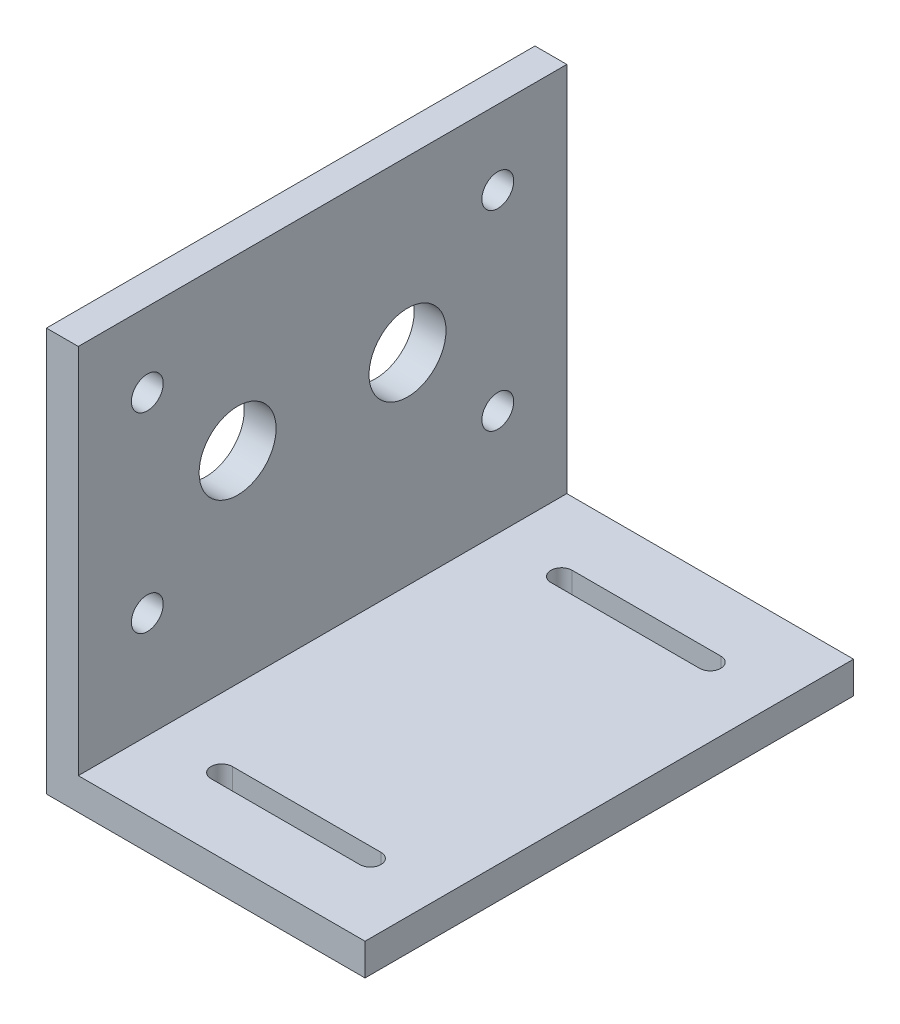
ISO-10303-21;
HEADER;
FILE_DESCRIPTION(('STEP AP214'),'2;1');
FILE_NAME('part.step','',(''),(''),'','','');
FILE_SCHEMA(('AUTOMOTIVE_DESIGN { 1 0 10303 214 1 1 1 1 }'));
ENDSEC;
DATA;
#1=APPLICATION_CONTEXT('core data for automotive mechanical design processes');
#2=APPLICATION_PROTOCOL_DEFINITION('international standard','automotive_design',2000,#1);
#3=PRODUCT_CONTEXT('',#1,'mechanical');
#4=PRODUCT('Part','Part','',(#3));
#5=PRODUCT_RELATED_PRODUCT_CATEGORY('part','',(#4));
#6=PRODUCT_DEFINITION_FORMATION('','',#4);
#7=PRODUCT_DEFINITION_CONTEXT('part definition',#1,'design');
#8=PRODUCT_DEFINITION('design','',#6,#7);
#9=PRODUCT_DEFINITION_SHAPE('','',#8);
#10=(LENGTH_UNIT() NAMED_UNIT(*) SI_UNIT(.MILLI.,.METRE.));
#11=(NAMED_UNIT(*) PLANE_ANGLE_UNIT() SI_UNIT($,.RADIAN.));
#12=(NAMED_UNIT(*) SI_UNIT($,.STERADIAN.) SOLID_ANGLE_UNIT());
#13=UNCERTAINTY_MEASURE_WITH_UNIT(LENGTH_MEASURE(1.E-05),#10,'distance_accuracy_value','');
#14=(GEOMETRIC_REPRESENTATION_CONTEXT(3) GLOBAL_UNCERTAINTY_ASSIGNED_CONTEXT((#13)) GLOBAL_UNIT_ASSIGNED_CONTEXT((#10,
#11,#12)) REPRESENTATION_CONTEXT('',''));
#15=CARTESIAN_POINT('',(0.,0.,0.));
#16=DIRECTION('',(0.,0.,1.));
#17=DIRECTION('',(1.,0.,0.));
#18=AXIS2_PLACEMENT_3D('',#15,#16,#17);
#19=CARTESIAN_POINT('',(0.,0.,46.));
#20=DIRECTION('',(1.,0.,0.));
#21=DIRECTION('',(0.,0.,-1.));
#22=AXIS2_PLACEMENT_3D('',#19,#20,#21);
#23=PLANE('',#22);
#24=CARTESIAN_POINT('',(0.,31.,6.5));
#25=DIRECTION('',(-1.,0.,0.));
#26=DIRECTION('',(0.,0.,-1.));
#27=AXIS2_PLACEMENT_3D('',#24,#25,#26);
#28=CIRCLE('',#27,1.5);
#29=CARTESIAN_POINT('',(0.,31.,4.99999999999999));
#30=VERTEX_POINT('',#29);
#31=EDGE_CURVE('E215',#30,#30,#28,.T.);
#32=ORIENTED_EDGE('',*,*,#31,.F.);
#33=EDGE_LOOP('',(#32));
#34=FACE_BOUND('',#33,.T.);
#35=CARTESIAN_POINT('',(0.,13.,39.5));
#36=DIRECTION('',(-1.,0.,0.));
#37=DIRECTION('',(0.,0.,-1.));
#38=AXIS2_PLACEMENT_3D('',#35,#36,#37);
#39=CIRCLE('',#38,1.5);
#40=CARTESIAN_POINT('',(0.,13.,38.));
#41=VERTEX_POINT('',#40);
#42=EDGE_CURVE('E214',#41,#41,#39,.T.);
#43=ORIENTED_EDGE('',*,*,#42,.F.);
#44=EDGE_LOOP('',(#43));
#45=FACE_BOUND('',#44,.T.);
#46=CARTESIAN_POINT('',(0.,13.,6.5));
#47=DIRECTION('',(-1.,0.,0.));
#48=DIRECTION('',(0.,0.,1.));
#49=AXIS2_PLACEMENT_3D('',#46,#47,#48);
#50=CIRCLE('',#49,1.5);
#51=CARTESIAN_POINT('',(0.,13.,8.));
#52=VERTEX_POINT('',#51);
#53=EDGE_CURVE('E211',#52,#52,#50,.T.);
#54=ORIENTED_EDGE('',*,*,#53,.F.);
#55=EDGE_LOOP('',(#54));
#56=FACE_BOUND('',#55,.T.);
#57=CARTESIAN_POINT('',(0.,31.,39.5));
#58=DIRECTION('',(-1.,0.,0.));
#59=DIRECTION('',(0.,0.,1.));
#60=AXIS2_PLACEMENT_3D('',#57,#58,#59);
#61=CIRCLE('',#60,1.5);
#62=CARTESIAN_POINT('',(0.,31.,41.));
#63=VERTEX_POINT('',#62);
#64=EDGE_CURVE('E218',#63,#63,#61,.T.);
#65=ORIENTED_EDGE('',*,*,#64,.F.);
#66=EDGE_LOOP('',(#65));
#67=FACE_BOUND('',#66,.T.);
#68=CARTESIAN_POINT('',(0.,22.,15.));
#69=DIRECTION('',(1.,0.,0.));
#70=DIRECTION('',(0.,0.,-1.));
#71=AXIS2_PLACEMENT_3D('',#68,#69,#70);
#72=CIRCLE('',#71,3.625);
#73=CARTESIAN_POINT('',(0.,22.,11.375));
#74=VERTEX_POINT('',#73);
#75=EDGE_CURVE('E233',#74,#74,#72,.T.);
#76=ORIENTED_EDGE('',*,*,#75,.T.);
#77=EDGE_LOOP('',(#76));
#78=FACE_BOUND('',#77,.T.);
#79=CARTESIAN_POINT('',(0.,22.,31.));
#80=DIRECTION('',(1.,0.,0.));
#81=DIRECTION('',(0.,0.,-1.));
#82=AXIS2_PLACEMENT_3D('',#79,#80,#81);
#83=CIRCLE('',#82,3.625);
#84=CARTESIAN_POINT('',(0.,22.,27.375));
#85=VERTEX_POINT('',#84);
#86=EDGE_CURVE('E227',#85,#85,#83,.T.);
#87=ORIENTED_EDGE('',*,*,#86,.T.);
#88=EDGE_LOOP('',(#87));
#89=FACE_BOUND('',#88,.T.);
#90=DIRECTION('',(0.,-1.,0.));
#91=VECTOR('',#90,1.);
#92=CARTESIAN_POINT('',(0.,0.,0.));
#93=LINE('',#92,#91);
#94=CARTESIAN_POINT('',(0.,38.,0.));
#95=VERTEX_POINT('',#94);
#96=CARTESIAN_POINT('',(0.,0.,0.));
#97=VERTEX_POINT('',#96);
#98=EDGE_CURVE('E236',#95,#97,#93,.T.);
#99=ORIENTED_EDGE('',*,*,#98,.T.);
#100=DIRECTION('',(0.,0.,-1.));
#101=VECTOR('',#100,1.);
#102=CARTESIAN_POINT('',(0.,0.,46.));
#103=LINE('',#102,#101);
#104=CARTESIAN_POINT('',(0.,0.,46.));
#105=VERTEX_POINT('',#104);
#106=EDGE_CURVE('E11',#105,#97,#103,.T.);
#107=ORIENTED_EDGE('',*,*,#106,.F.);
#108=DIRECTION('',(0.,-1.,0.));
#109=VECTOR('',#108,1.);
#110=CARTESIAN_POINT('',(0.,0.,46.));
#111=LINE('',#110,#109);
#112=CARTESIAN_POINT('',(0.,38.,46.));
#113=VERTEX_POINT('',#112);
#114=EDGE_CURVE('E237',#113,#105,#111,.T.);
#115=ORIENTED_EDGE('',*,*,#114,.F.);
#116=DIRECTION('',(0.,0.,-1.));
#117=VECTOR('',#116,1.);
#118=CARTESIAN_POINT('',(0.,38.,46.));
#119=LINE('',#118,#117);
#120=EDGE_CURVE('E251',#113,#95,#119,.T.);
#121=ORIENTED_EDGE('',*,*,#120,.T.);
#122=EDGE_LOOP('',(#99,#107,#115,#121));
#123=FACE_BOUND('',#122,.T.);
#124=ADVANCED_FACE('F39',(#34,#45,#56,#67,#78,#89,#123),#23,.F.);
#125=CARTESIAN_POINT('',(0.,0.,46.));
#126=DIRECTION('',(0.,1.,0.));
#127=DIRECTION('',(0.,0.,1.));
#128=AXIS2_PLACEMENT_3D('',#125,#126,#127);
#129=PLANE('',#128);
#130=DIRECTION('',(1.,0.,0.));
#131=VECTOR('',#130,1.);
#132=CARTESIAN_POINT('',(0.,0.,8.));
#133=LINE('',#132,#131);
#134=CARTESIAN_POINT('',(9.49999999999999,0.,8.));
#135=VERTEX_POINT('',#134);
#136=CARTESIAN_POINT('',(23.5,0.,8.));
#137=VERTEX_POINT('',#136);
#138=EDGE_CURVE('E205',#135,#137,#133,.T.);
#139=ORIENTED_EDGE('',*,*,#138,.T.);
#140=CARTESIAN_POINT('',(23.5,0.,7.));
#141=DIRECTION('',(0.,1.,0.));
#142=DIRECTION('',(0.,0.,1.));
#143=AXIS2_PLACEMENT_3D('',#140,#141,#142);
#144=CIRCLE('',#143,1.);
#145=CARTESIAN_POINT('',(23.5,0.,6.));
#146=VERTEX_POINT('',#145);
#147=EDGE_CURVE('E208',#137,#146,#144,.T.);
#148=ORIENTED_EDGE('',*,*,#147,.T.);
#149=DIRECTION('',(-1.,0.,0.));
#150=VECTOR('',#149,1.);
#151=CARTESIAN_POINT('',(0.,0.,6.));
#152=LINE('',#151,#150);
#153=CARTESIAN_POINT('',(9.49999999999999,0.,6.));
#154=VERTEX_POINT('',#153);
#155=EDGE_CURVE('E202',#146,#154,#152,.T.);
#156=ORIENTED_EDGE('',*,*,#155,.T.);
#157=CARTESIAN_POINT('',(9.49999999999998,0.,7.));
#158=DIRECTION('',(0.,1.,0.));
#159=DIRECTION('',(0.,0.,1.));
#160=AXIS2_PLACEMENT_3D('',#157,#158,#159);
#161=CIRCLE('',#160,1.);
#162=EDGE_CURVE('E146',#154,#135,#161,.T.);
#163=ORIENTED_EDGE('',*,*,#162,.T.);
#164=EDGE_LOOP('',(#139,#148,#156,#163));
#165=FACE_BOUND('',#164,.T.);
#166=DIRECTION('',(1.,0.,0.));
#167=VECTOR('',#166,1.);
#168=CARTESIAN_POINT('',(0.,0.,40.));
#169=LINE('',#168,#167);
#170=CARTESIAN_POINT('',(9.49999999999999,0.,40.));
#171=VERTEX_POINT('',#170);
#172=CARTESIAN_POINT('',(23.5,0.,40.));
#173=VERTEX_POINT('',#172);
#174=EDGE_CURVE('E196',#171,#173,#169,.T.);
#175=ORIENTED_EDGE('',*,*,#174,.T.);
#176=CARTESIAN_POINT('',(23.5,0.,39.));
#177=DIRECTION('',(0.,1.,0.));
#178=DIRECTION('',(0.,0.,1.));
#179=AXIS2_PLACEMENT_3D('',#176,#177,#178);
#180=CIRCLE('',#179,1.);
#181=CARTESIAN_POINT('',(23.5,0.,38.));
#182=VERTEX_POINT('',#181);
#183=EDGE_CURVE('E199',#173,#182,#180,.T.);
#184=ORIENTED_EDGE('',*,*,#183,.T.);
#185=DIRECTION('',(-1.,0.,0.));
#186=VECTOR('',#185,1.);
#187=CARTESIAN_POINT('',(0.,0.,38.));
#188=LINE('',#187,#186);
#189=CARTESIAN_POINT('',(9.49999999999998,0.,38.));
#190=VERTEX_POINT('',#189);
#191=EDGE_CURVE('E170',#182,#190,#188,.T.);
#192=ORIENTED_EDGE('',*,*,#191,.T.);
#193=CARTESIAN_POINT('',(9.49999999999998,0.,39.));
#194=DIRECTION('',(0.,1.,0.));
#195=DIRECTION('',(0.,0.,1.));
#196=AXIS2_PLACEMENT_3D('',#193,#194,#195);
#197=CIRCLE('',#196,1.);
#198=EDGE_CURVE('E193',#190,#171,#197,.T.);
#199=ORIENTED_EDGE('',*,*,#198,.T.);
#200=EDGE_LOOP('',(#175,#184,#192,#199));
#201=FACE_BOUND('',#200,.T.);
#202=DIRECTION('',(1.,0.,0.));
#203=VECTOR('',#202,1.);
#204=CARTESIAN_POINT('',(0.,0.,0.));
#205=LINE('',#204,#203);
#206=CARTESIAN_POINT('',(30.,0.,0.));
#207=VERTEX_POINT('',#206);
#208=EDGE_CURVE('E254',#97,#207,#205,.T.);
#209=ORIENTED_EDGE('',*,*,#208,.T.);
#210=DIRECTION('',(0.,0.,-1.));
#211=VECTOR('',#210,1.);
#212=CARTESIAN_POINT('',(30.,0.,46.));
#213=LINE('',#212,#211);
#214=CARTESIAN_POINT('',(30.,0.,46.));
#215=VERTEX_POINT('',#214);
#216=EDGE_CURVE('E47',#215,#207,#213,.T.);
#217=ORIENTED_EDGE('',*,*,#216,.F.);
#218=DIRECTION('',(1.,0.,0.));
#219=VECTOR('',#218,1.);
#220=CARTESIAN_POINT('',(0.,0.,46.));
#221=LINE('',#220,#219);
#222=EDGE_CURVE('E240',#105,#215,#221,.T.);
#223=ORIENTED_EDGE('',*,*,#222,.F.);
#224=ORIENTED_EDGE('',*,*,#106,.T.);
#225=EDGE_LOOP('',(#209,#217,#223,#224));
#226=FACE_BOUND('',#225,.T.);
#227=ADVANCED_FACE('F308',(#165,#201,#226),#129,.F.);
#228=CARTESIAN_POINT('',(30.,0.,46.));
#229=DIRECTION('',(-1.,0.,0.));
#230=DIRECTION('',(0.,0.,1.));
#231=AXIS2_PLACEMENT_3D('',#228,#229,#230);
#232=PLANE('',#231);
#233=DIRECTION('',(0.,1.,0.));
#234=VECTOR('',#233,1.);
#235=CARTESIAN_POINT('',(30.,0.,0.));
#236=LINE('',#235,#234);
#237=CARTESIAN_POINT('',(30.,3.,0.));
#238=VERTEX_POINT('',#237);
#239=EDGE_CURVE('E256',#207,#238,#236,.T.);
#240=ORIENTED_EDGE('',*,*,#239,.T.);
#241=DIRECTION('',(0.,0.,-1.));
#242=VECTOR('',#241,1.);
#243=CARTESIAN_POINT('',(30.,3.,46.));
#244=LINE('',#243,#242);
#245=CARTESIAN_POINT('',(30.,3.,46.));
#246=VERTEX_POINT('',#245);
#247=EDGE_CURVE('E271',#246,#238,#244,.T.);
#248=ORIENTED_EDGE('',*,*,#247,.F.);
#249=DIRECTION('',(0.,1.,0.));
#250=VECTOR('',#249,1.);
#251=CARTESIAN_POINT('',(30.,0.,46.));
#252=LINE('',#251,#250);
#253=EDGE_CURVE('E243',#215,#246,#252,.T.);
#254=ORIENTED_EDGE('',*,*,#253,.F.);
#255=ORIENTED_EDGE('',*,*,#216,.T.);
#256=EDGE_LOOP('',(#240,#248,#254,#255));
#257=FACE_BOUND('',#256,.T.);
#258=ADVANCED_FACE('F314',(#257),#232,.F.);
#259=CARTESIAN_POINT('',(3.,3.,46.));
#260=DIRECTION('',(0.,-1.,0.));
#261=DIRECTION('',(0.,0.,-1.));
#262=AXIS2_PLACEMENT_3D('',#259,#260,#261);
#263=PLANE('',#262);
#264=DIRECTION('',(-1.,0.,0.));
#265=VECTOR('',#264,1.);
#266=CARTESIAN_POINT('',(9.49999999999999,3.,6.));
#267=LINE('',#266,#265);
#268=CARTESIAN_POINT('',(23.5,3.,6.));
#269=VERTEX_POINT('',#268);
#270=CARTESIAN_POINT('',(9.49999999999999,3.,6.));
#271=VERTEX_POINT('',#270);
#272=EDGE_CURVE('E153',#269,#271,#267,.T.);
#273=ORIENTED_EDGE('',*,*,#272,.F.);
#274=CARTESIAN_POINT('',(23.5,3.,7.));
#275=DIRECTION('',(0.,1.,0.));
#276=DIRECTION('',(0.,0.,-1.));
#277=AXIS2_PLACEMENT_3D('',#274,#275,#276);
#278=CIRCLE('',#277,1.);
#279=CARTESIAN_POINT('',(23.5,3.,8.));
#280=VERTEX_POINT('',#279);
#281=EDGE_CURVE('E158',#280,#269,#278,.T.);
#282=ORIENTED_EDGE('',*,*,#281,.F.);
#283=DIRECTION('',(1.,0.,0.));
#284=VECTOR('',#283,1.);
#285=CARTESIAN_POINT('',(9.49999999999999,3.,8.));
#286=LINE('',#285,#284);
#287=CARTESIAN_POINT('',(9.49999999999999,3.,8.));
#288=VERTEX_POINT('',#287);
#289=EDGE_CURVE('E163',#288,#280,#286,.T.);
#290=ORIENTED_EDGE('',*,*,#289,.F.);
#291=CARTESIAN_POINT('',(9.49999999999998,3.,7.));
#292=DIRECTION('',(0.,1.,0.));
#293=DIRECTION('',(0.,0.,1.));
#294=AXIS2_PLACEMENT_3D('',#291,#292,#293);
#295=CIRCLE('',#294,1.);
#296=EDGE_CURVE('E143',#271,#288,#295,.T.);
#297=ORIENTED_EDGE('',*,*,#296,.F.);
#298=EDGE_LOOP('',(#273,#282,#290,#297));
#299=FACE_BOUND('',#298,.T.);
#300=DIRECTION('',(-1.,0.,0.));
#301=VECTOR('',#300,1.);
#302=CARTESIAN_POINT('',(9.49999999999999,3.,38.));
#303=LINE('',#302,#301);
#304=CARTESIAN_POINT('',(23.5,3.,38.));
#305=VERTEX_POINT('',#304);
#306=CARTESIAN_POINT('',(9.49999999999998,3.,38.));
#307=VERTEX_POINT('',#306);
#308=EDGE_CURVE('E187',#305,#307,#303,.T.);
#309=ORIENTED_EDGE('',*,*,#308,.F.);
#310=CARTESIAN_POINT('',(23.5,3.,39.));
#311=DIRECTION('',(0.,1.,0.));
#312=DIRECTION('',(0.,0.,1.));
#313=AXIS2_PLACEMENT_3D('',#310,#311,#312);
#314=CIRCLE('',#313,1.);
#315=CARTESIAN_POINT('',(23.5,3.,40.));
#316=VERTEX_POINT('',#315);
#317=EDGE_CURVE('E189',#316,#305,#314,.T.);
#318=ORIENTED_EDGE('',*,*,#317,.F.);
#319=DIRECTION('',(1.,0.,0.));
#320=VECTOR('',#319,1.);
#321=CARTESIAN_POINT('',(9.49999999999999,3.,40.));
#322=LINE('',#321,#320);
#323=CARTESIAN_POINT('',(9.49999999999999,3.,40.));
#324=VERTEX_POINT('',#323);
#325=EDGE_CURVE('E176',#324,#316,#322,.T.);
#326=ORIENTED_EDGE('',*,*,#325,.F.);
#327=CARTESIAN_POINT('',(9.49999999999998,3.,39.));
#328=DIRECTION('',(0.,1.,0.));
#329=DIRECTION('',(0.,0.,-1.));
#330=AXIS2_PLACEMENT_3D('',#327,#328,#329);
#331=CIRCLE('',#330,1.);
#332=EDGE_CURVE('E184',#307,#324,#331,.T.);
#333=ORIENTED_EDGE('',*,*,#332,.F.);
#334=EDGE_LOOP('',(#309,#318,#326,#333));
#335=FACE_BOUND('',#334,.T.);
#336=DIRECTION('',(-1.,0.,0.));
#337=VECTOR('',#336,1.);
#338=CARTESIAN_POINT('',(3.,3.,0.));
#339=LINE('',#338,#337);
#340=CARTESIAN_POINT('',(3.,3.,0.));
#341=VERTEX_POINT('',#340);
#342=EDGE_CURVE('E258',#238,#341,#339,.T.);
#343=ORIENTED_EDGE('',*,*,#342,.T.);
#344=DIRECTION('',(0.,0.,-1.));
#345=VECTOR('',#344,1.);
#346=CARTESIAN_POINT('',(3.,3.,46.));
#347=LINE('',#346,#345);
#348=CARTESIAN_POINT('',(3.,3.,46.));
#349=VERTEX_POINT('',#348);
#350=EDGE_CURVE('E268',#349,#341,#347,.T.);
#351=ORIENTED_EDGE('',*,*,#350,.F.);
#352=DIRECTION('',(-1.,0.,0.));
#353=VECTOR('',#352,1.);
#354=CARTESIAN_POINT('',(3.,3.,46.));
#355=LINE('',#354,#353);
#356=EDGE_CURVE('E245',#246,#349,#355,.T.);
#357=ORIENTED_EDGE('',*,*,#356,.F.);
#358=ORIENTED_EDGE('',*,*,#247,.T.);
#359=EDGE_LOOP('',(#343,#351,#357,#358));
#360=FACE_BOUND('',#359,.T.);
#361=ADVANCED_FACE('F160',(#299,#335,#360),#263,.F.);
#362=CARTESIAN_POINT('',(3.,3.,46.));
#363=DIRECTION('',(-1.,0.,0.));
#364=DIRECTION('',(0.,0.,1.));
#365=AXIS2_PLACEMENT_3D('',#362,#363,#364);
#366=PLANE('',#365);
#367=CARTESIAN_POINT('',(3.,31.,6.5));
#368=DIRECTION('',(-1.,0.,0.));
#369=DIRECTION('',(0.,0.,1.));
#370=AXIS2_PLACEMENT_3D('',#367,#368,#369);
#371=CIRCLE('',#370,1.5);
#372=CARTESIAN_POINT('',(3.,31.,8.));
#373=VERTEX_POINT('',#372);
#374=EDGE_CURVE('E42',#373,#373,#371,.T.);
#375=ORIENTED_EDGE('',*,*,#374,.T.);
#376=EDGE_LOOP('',(#375));
#377=FACE_BOUND('',#376,.T.);
#378=CARTESIAN_POINT('',(3.,13.,39.5));
#379=DIRECTION('',(-1.,0.,0.));
#380=DIRECTION('',(0.,0.,1.));
#381=AXIS2_PLACEMENT_3D('',#378,#379,#380);
#382=CIRCLE('',#381,1.5);
#383=CARTESIAN_POINT('',(3.,13.,41.));
#384=VERTEX_POINT('',#383);
#385=EDGE_CURVE('E280',#384,#384,#382,.T.);
#386=ORIENTED_EDGE('',*,*,#385,.T.);
#387=EDGE_LOOP('',(#386));
#388=FACE_BOUND('',#387,.T.);
#389=CARTESIAN_POINT('',(3.,13.,6.5));
#390=DIRECTION('',(-1.,0.,0.));
#391=DIRECTION('',(0.,0.,1.));
#392=AXIS2_PLACEMENT_3D('',#389,#390,#391);
#393=CIRCLE('',#392,1.5);
#394=CARTESIAN_POINT('',(3.,13.,8.));
#395=VERTEX_POINT('',#394);
#396=EDGE_CURVE('E278',#395,#395,#393,.T.);
#397=ORIENTED_EDGE('',*,*,#396,.T.);
#398=EDGE_LOOP('',(#397));
#399=FACE_BOUND('',#398,.T.);
#400=CARTESIAN_POINT('',(3.,31.,39.5));
#401=DIRECTION('',(-1.,0.,0.));
#402=DIRECTION('',(0.,0.,1.));
#403=AXIS2_PLACEMENT_3D('',#400,#401,#402);
#404=CIRCLE('',#403,1.5);
#405=CARTESIAN_POINT('',(3.,31.,41.));
#406=VERTEX_POINT('',#405);
#407=EDGE_CURVE('E223',#406,#406,#404,.T.);
#408=ORIENTED_EDGE('',*,*,#407,.T.);
#409=EDGE_LOOP('',(#408));
#410=FACE_BOUND('',#409,.T.);
#411=CARTESIAN_POINT('',(3.,22.,15.));
#412=DIRECTION('',(1.,0.,0.));
#413=DIRECTION('',(0.,0.,-1.));
#414=AXIS2_PLACEMENT_3D('',#411,#412,#413);
#415=CIRCLE('',#414,3.625);
#416=CARTESIAN_POINT('',(3.,22.,11.375));
#417=VERTEX_POINT('',#416);
#418=EDGE_CURVE('E224',#417,#417,#415,.T.);
#419=ORIENTED_EDGE('',*,*,#418,.F.);
#420=EDGE_LOOP('',(#419));
#421=FACE_BOUND('',#420,.T.);
#422=CARTESIAN_POINT('',(3.,22.,31.));
#423=DIRECTION('',(1.,0.,0.));
#424=DIRECTION('',(0.,0.,1.));
#425=AXIS2_PLACEMENT_3D('',#422,#423,#424);
#426=CIRCLE('',#425,3.625);
#427=CARTESIAN_POINT('',(3.,22.,34.625));
#428=VERTEX_POINT('',#427);
#429=EDGE_CURVE('E228',#428,#428,#426,.T.);
#430=ORIENTED_EDGE('',*,*,#429,.F.);
#431=EDGE_LOOP('',(#430));
#432=FACE_BOUND('',#431,.T.);
#433=DIRECTION('',(0.,1.,0.));
#434=VECTOR('',#433,1.);
#435=CARTESIAN_POINT('',(3.,3.,0.));
#436=LINE('',#435,#434);
#437=CARTESIAN_POINT('',(3.,38.,0.));
#438=VERTEX_POINT('',#437);
#439=EDGE_CURVE('E260',#341,#438,#436,.T.);
#440=ORIENTED_EDGE('',*,*,#439,.T.);
#441=DIRECTION('',(0.,0.,-1.));
#442=VECTOR('',#441,1.);
#443=CARTESIAN_POINT('',(3.,38.,46.));
#444=LINE('',#443,#442);
#445=CARTESIAN_POINT('',(3.,38.,46.));
#446=VERTEX_POINT('',#445);
#447=EDGE_CURVE('E265',#446,#438,#444,.T.);
#448=ORIENTED_EDGE('',*,*,#447,.F.);
#449=DIRECTION('',(0.,1.,0.));
#450=VECTOR('',#449,1.);
#451=CARTESIAN_POINT('',(3.,3.,46.));
#452=LINE('',#451,#450);
#453=EDGE_CURVE('E247',#349,#446,#452,.T.);
#454=ORIENTED_EDGE('',*,*,#453,.F.);
#455=ORIENTED_EDGE('',*,*,#350,.T.);
#456=EDGE_LOOP('',(#440,#448,#454,#455));
#457=FACE_BOUND('',#456,.T.);
#458=ADVANCED_FACE('F287',(#377,#388,#399,#410,#421,#432,#457),#366,.F.);
#459=CARTESIAN_POINT('',(0.,38.,46.));
#460=DIRECTION('',(0.,-1.,0.));
#461=DIRECTION('',(0.,0.,-1.));
#462=AXIS2_PLACEMENT_3D('',#459,#460,#461);
#463=PLANE('',#462);
#464=DIRECTION('',(-1.,0.,0.));
#465=VECTOR('',#464,1.);
#466=CARTESIAN_POINT('',(0.,38.,0.));
#467=LINE('',#466,#465);
#468=EDGE_CURVE('E241',#438,#95,#467,.T.);
#469=ORIENTED_EDGE('',*,*,#468,.T.);
#470=ORIENTED_EDGE('',*,*,#120,.F.);
#471=DIRECTION('',(-1.,0.,0.));
#472=VECTOR('',#471,1.);
#473=CARTESIAN_POINT('',(0.,38.,46.));
#474=LINE('',#473,#472);
#475=EDGE_CURVE('E249',#446,#113,#474,.T.);
#476=ORIENTED_EDGE('',*,*,#475,.F.);
#477=ORIENTED_EDGE('',*,*,#447,.T.);
#478=EDGE_LOOP('',(#469,#470,#476,#477));
#479=FACE_BOUND('',#478,.T.);
#480=ADVANCED_FACE('F347',(#479),#463,.F.);
#481=CARTESIAN_POINT('',(0.,0.,46.));
#482=DIRECTION('',(0.,0.,-1.));
#483=DIRECTION('',(-1.,0.,0.));
#484=AXIS2_PLACEMENT_3D('',#481,#482,#483);
#485=PLANE('',#484);
#486=ORIENTED_EDGE('',*,*,#114,.T.);
#487=ORIENTED_EDGE('',*,*,#222,.T.);
#488=ORIENTED_EDGE('',*,*,#253,.T.);
#489=ORIENTED_EDGE('',*,*,#356,.T.);
#490=ORIENTED_EDGE('',*,*,#453,.T.);
#491=ORIENTED_EDGE('',*,*,#475,.T.);
#492=EDGE_LOOP('',(#486,#487,#488,#489,#490,#491));
#493=FACE_BOUND('',#492,.T.);
#494=ADVANCED_FACE('F342',(#493),#485,.F.);
#495=CARTESIAN_POINT('',(0.,0.,0.));
#496=DIRECTION('',(0.,0.,-1.));
#497=DIRECTION('',(-1.,0.,0.));
#498=AXIS2_PLACEMENT_3D('',#495,#496,#497);
#499=PLANE('',#498);
#500=ORIENTED_EDGE('',*,*,#98,.F.);
#501=ORIENTED_EDGE('',*,*,#468,.F.);
#502=ORIENTED_EDGE('',*,*,#439,.F.);
#503=ORIENTED_EDGE('',*,*,#342,.F.);
#504=ORIENTED_EDGE('',*,*,#239,.F.);
#505=ORIENTED_EDGE('',*,*,#208,.F.);
#506=EDGE_LOOP('',(#500,#501,#502,#503,#504,#505));
#507=FACE_BOUND('',#506,.T.);
#508=ADVANCED_FACE('F334',(#507),#499,.T.);
#509=CARTESIAN_POINT('',(-43.,22.,31.));
#510=DIRECTION('',(1.,0.,0.));
#511=DIRECTION('',(0.,0.,-1.));
#512=AXIS2_PLACEMENT_3D('',#509,#510,#511);
#513=CYLINDRICAL_SURFACE('',#512,3.625);
#514=ORIENTED_EDGE('',*,*,#429,.T.);
#515=EDGE_LOOP('',(#514));
#516=FACE_BOUND('',#515,.T.);
#517=ORIENTED_EDGE('',*,*,#86,.F.);
#518=EDGE_LOOP('',(#517));
#519=FACE_BOUND('',#518,.T.);
#520=ADVANCED_FACE('F366',(#516,#519),#513,.F.);
#521=CARTESIAN_POINT('',(-43.,22.,15.));
#522=DIRECTION('',(1.,0.,0.));
#523=DIRECTION('',(0.,0.,-1.));
#524=AXIS2_PLACEMENT_3D('',#521,#522,#523);
#525=CYLINDRICAL_SURFACE('',#524,3.625);
#526=ORIENTED_EDGE('',*,*,#418,.T.);
#527=EDGE_LOOP('',(#526));
#528=FACE_BOUND('',#527,.T.);
#529=ORIENTED_EDGE('',*,*,#75,.F.);
#530=EDGE_LOOP('',(#529));
#531=FACE_BOUND('',#530,.T.);
#532=ADVANCED_FACE('F371',(#528,#531),#525,.F.);
#533=CARTESIAN_POINT('',(10.,31.,39.5));
#534=DIRECTION('',(-1.,0.,0.));
#535=DIRECTION('',(0.,0.,1.));
#536=AXIS2_PLACEMENT_3D('',#533,#534,#535);
#537=CYLINDRICAL_SURFACE('',#536,1.5);
#538=ORIENTED_EDGE('',*,*,#64,.T.);
#539=EDGE_LOOP('',(#538));
#540=FACE_BOUND('',#539,.T.);
#541=ORIENTED_EDGE('',*,*,#407,.F.);
#542=EDGE_LOOP('',(#541));
#543=FACE_BOUND('',#542,.T.);
#544=ADVANCED_FACE('F374',(#540,#543),#537,.F.);
#545=CARTESIAN_POINT('',(10.,13.,6.5));
#546=DIRECTION('',(-1.,0.,0.));
#547=DIRECTION('',(0.,0.,1.));
#548=AXIS2_PLACEMENT_3D('',#545,#546,#547);
#549=CYLINDRICAL_SURFACE('',#548,1.5);
#550=ORIENTED_EDGE('',*,*,#53,.T.);
#551=EDGE_LOOP('',(#550));
#552=FACE_BOUND('',#551,.T.);
#553=ORIENTED_EDGE('',*,*,#396,.F.);
#554=EDGE_LOOP('',(#553));
#555=FACE_BOUND('',#554,.T.);
#556=ADVANCED_FACE('F303',(#552,#555),#549,.F.);
#557=CARTESIAN_POINT('',(10.,13.,39.5));
#558=DIRECTION('',(-1.,0.,0.));
#559=DIRECTION('',(0.,0.,1.));
#560=AXIS2_PLACEMENT_3D('',#557,#558,#559);
#561=CYLINDRICAL_SURFACE('',#560,1.5);
#562=ORIENTED_EDGE('',*,*,#42,.T.);
#563=EDGE_LOOP('',(#562));
#564=FACE_BOUND('',#563,.T.);
#565=ORIENTED_EDGE('',*,*,#385,.F.);
#566=EDGE_LOOP('',(#565));
#567=FACE_BOUND('',#566,.T.);
#568=ADVANCED_FACE('F292',(#564,#567),#561,.F.);
#569=CARTESIAN_POINT('',(10.,31.,6.5));
#570=DIRECTION('',(-1.,0.,0.));
#571=DIRECTION('',(0.,0.,1.));
#572=AXIS2_PLACEMENT_3D('',#569,#570,#571);
#573=CYLINDRICAL_SURFACE('',#572,1.5);
#574=ORIENTED_EDGE('',*,*,#31,.T.);
#575=EDGE_LOOP('',(#574));
#576=FACE_BOUND('',#575,.T.);
#577=ORIENTED_EDGE('',*,*,#374,.F.);
#578=EDGE_LOOP('',(#577));
#579=FACE_BOUND('',#578,.T.);
#580=ADVANCED_FACE('F289',(#576,#579),#573,.F.);
#581=CARTESIAN_POINT('',(23.5,-7.,39.));
#582=DIRECTION('',(0.,1.,0.));
#583=DIRECTION('',(0.,0.,1.));
#584=AXIS2_PLACEMENT_3D('',#581,#582,#583);
#585=CYLINDRICAL_SURFACE('',#584,1.);
#586=DIRECTION('',(0.,1.,0.));
#587=VECTOR('',#586,1.);
#588=CARTESIAN_POINT('',(23.5,-7.,40.));
#589=LINE('',#588,#587);
#590=EDGE_CURVE('E180',#173,#316,#589,.T.);
#591=ORIENTED_EDGE('',*,*,#590,.T.);
#592=ORIENTED_EDGE('',*,*,#317,.T.);
#593=DIRECTION('',(0.,1.,0.));
#594=VECTOR('',#593,1.);
#595=CARTESIAN_POINT('',(23.5,-7.,38.));
#596=LINE('',#595,#594);
#597=EDGE_CURVE('E173',#182,#305,#596,.T.);
#598=ORIENTED_EDGE('',*,*,#597,.F.);
#599=ORIENTED_EDGE('',*,*,#183,.F.);
#600=EDGE_LOOP('',(#591,#592,#598,#599));
#601=FACE_BOUND('',#600,.T.);
#602=ADVANCED_FACE('F291',(#601),#585,.F.);
#603=CARTESIAN_POINT('',(9.49999999999999,-7.,40.));
#604=DIRECTION('',(0.,0.,1.));
#605=DIRECTION('',(1.,0.,0.));
#606=AXIS2_PLACEMENT_3D('',#603,#604,#605);
#607=PLANE('',#606);
#608=DIRECTION('',(0.,1.,0.));
#609=VECTOR('',#608,1.);
#610=CARTESIAN_POINT('',(9.49999999999999,-7.,40.));
#611=LINE('',#610,#609);
#612=EDGE_CURVE('E178',#171,#324,#611,.T.);
#613=ORIENTED_EDGE('',*,*,#612,.T.);
#614=ORIENTED_EDGE('',*,*,#325,.T.);
#615=ORIENTED_EDGE('',*,*,#590,.F.);
#616=ORIENTED_EDGE('',*,*,#174,.F.);
#617=EDGE_LOOP('',(#613,#614,#615,#616));
#618=FACE_BOUND('',#617,.T.);
#619=ADVANCED_FACE('F300',(#618),#607,.F.);
#620=CARTESIAN_POINT('',(9.49999999999998,-7.,39.));
#621=DIRECTION('',(0.,1.,0.));
#622=DIRECTION('',(0.,0.,1.));
#623=AXIS2_PLACEMENT_3D('',#620,#621,#622);
#624=CYLINDRICAL_SURFACE('',#623,1.);
#625=DIRECTION('',(0.,1.,0.));
#626=VECTOR('',#625,1.);
#627=CARTESIAN_POINT('',(9.49999999999998,-7.,38.));
#628=LINE('',#627,#626);
#629=EDGE_CURVE('E63',#190,#307,#628,.T.);
#630=ORIENTED_EDGE('',*,*,#629,.T.);
#631=ORIENTED_EDGE('',*,*,#332,.T.);
#632=ORIENTED_EDGE('',*,*,#612,.F.);
#633=ORIENTED_EDGE('',*,*,#198,.F.);
#634=EDGE_LOOP('',(#630,#631,#632,#633));
#635=FACE_BOUND('',#634,.T.);
#636=ADVANCED_FACE('F397',(#635),#624,.F.);
#637=CARTESIAN_POINT('',(9.49999999999999,-7.,38.));
#638=DIRECTION('',(0.,0.,-1.));
#639=DIRECTION('',(-1.,0.,0.));
#640=AXIS2_PLACEMENT_3D('',#637,#638,#639);
#641=PLANE('',#640);
#642=ORIENTED_EDGE('',*,*,#597,.T.);
#643=ORIENTED_EDGE('',*,*,#308,.T.);
#644=ORIENTED_EDGE('',*,*,#629,.F.);
#645=ORIENTED_EDGE('',*,*,#191,.F.);
#646=EDGE_LOOP('',(#642,#643,#644,#645));
#647=FACE_BOUND('',#646,.T.);
#648=ADVANCED_FACE('F401',(#647),#641,.F.);
#649=CARTESIAN_POINT('',(23.5,-7.,7.));
#650=DIRECTION('',(0.,1.,0.));
#651=DIRECTION('',(0.,0.,1.));
#652=AXIS2_PLACEMENT_3D('',#649,#650,#651);
#653=CYLINDRICAL_SURFACE('',#652,1.);
#654=DIRECTION('',(0.,1.,0.));
#655=VECTOR('',#654,1.);
#656=CARTESIAN_POINT('',(23.5,-7.,8.));
#657=LINE('',#656,#655);
#658=EDGE_CURVE('E168',#137,#280,#657,.T.);
#659=ORIENTED_EDGE('',*,*,#658,.T.);
#660=ORIENTED_EDGE('',*,*,#281,.T.);
#661=DIRECTION('',(0.,1.,0.));
#662=VECTOR('',#661,1.);
#663=CARTESIAN_POINT('',(23.5,-7.,6.));
#664=LINE('',#663,#662);
#665=EDGE_CURVE('E149',#146,#269,#664,.T.);
#666=ORIENTED_EDGE('',*,*,#665,.F.);
#667=ORIENTED_EDGE('',*,*,#147,.F.);
#668=EDGE_LOOP('',(#659,#660,#666,#667));
#669=FACE_BOUND('',#668,.T.);
#670=ADVANCED_FACE('F404',(#669),#653,.F.);
#671=CARTESIAN_POINT('',(9.49999999999999,-7.,8.));
#672=DIRECTION('',(0.,0.,1.));
#673=DIRECTION('',(1.,0.,0.));
#674=AXIS2_PLACEMENT_3D('',#671,#672,#673);
#675=PLANE('',#674);
#676=DIRECTION('',(0.,1.,0.));
#677=VECTOR('',#676,1.);
#678=CARTESIAN_POINT('',(9.49999999999999,-7.,8.));
#679=LINE('',#678,#677);
#680=EDGE_CURVE('E148',#135,#288,#679,.T.);
#681=ORIENTED_EDGE('',*,*,#680,.T.);
#682=ORIENTED_EDGE('',*,*,#289,.T.);
#683=ORIENTED_EDGE('',*,*,#658,.F.);
#684=ORIENTED_EDGE('',*,*,#138,.F.);
#685=EDGE_LOOP('',(#681,#682,#683,#684));
#686=FACE_BOUND('',#685,.T.);
#687=ADVANCED_FACE('F408',(#686),#675,.F.);
#688=CARTESIAN_POINT('',(9.49999999999998,-7.,7.));
#689=DIRECTION('',(0.,1.,0.));
#690=DIRECTION('',(0.,0.,1.));
#691=AXIS2_PLACEMENT_3D('',#688,#689,#690);
#692=CYLINDRICAL_SURFACE('',#691,1.);
#693=DIRECTION('',(0.,1.,0.));
#694=VECTOR('',#693,1.);
#695=CARTESIAN_POINT('',(9.49999999999999,-7.,6.));
#696=LINE('',#695,#694);
#697=EDGE_CURVE('E55',#154,#271,#696,.T.);
#698=ORIENTED_EDGE('',*,*,#697,.T.);
#699=ORIENTED_EDGE('',*,*,#296,.T.);
#700=ORIENTED_EDGE('',*,*,#680,.F.);
#701=ORIENTED_EDGE('',*,*,#162,.F.);
#702=EDGE_LOOP('',(#698,#699,#700,#701));
#703=FACE_BOUND('',#702,.T.);
#704=ADVANCED_FACE('F140',(#703),#692,.F.);
#705=CARTESIAN_POINT('',(9.49999999999999,-7.,6.));
#706=DIRECTION('',(0.,0.,-1.));
#707=DIRECTION('',(-1.,0.,0.));
#708=AXIS2_PLACEMENT_3D('',#705,#706,#707);
#709=PLANE('',#708);
#710=ORIENTED_EDGE('',*,*,#665,.T.);
#711=ORIENTED_EDGE('',*,*,#272,.T.);
#712=ORIENTED_EDGE('',*,*,#697,.F.);
#713=ORIENTED_EDGE('',*,*,#155,.F.);
#714=EDGE_LOOP('',(#710,#711,#712,#713));
#715=FACE_BOUND('',#714,.T.);
#716=ADVANCED_FACE('F154',(#715),#709,.F.);
#717=CLOSED_SHELL('',(#124,#227,#258,#361,#458,#480,#494,#508,#520,#532,#544,#556,#568,#580,
#602,#619,#636,#648,#670,#687,#704,#716));
#718=MANIFOLD_SOLID_BREP('B2',#717);
#719=ADVANCED_BREP_SHAPE_REPRESENTATION('',(#18,#718),#14);
#720=SHAPE_DEFINITION_REPRESENTATION(#9,#719);
ENDSEC;
END-ISO-10303-21;
